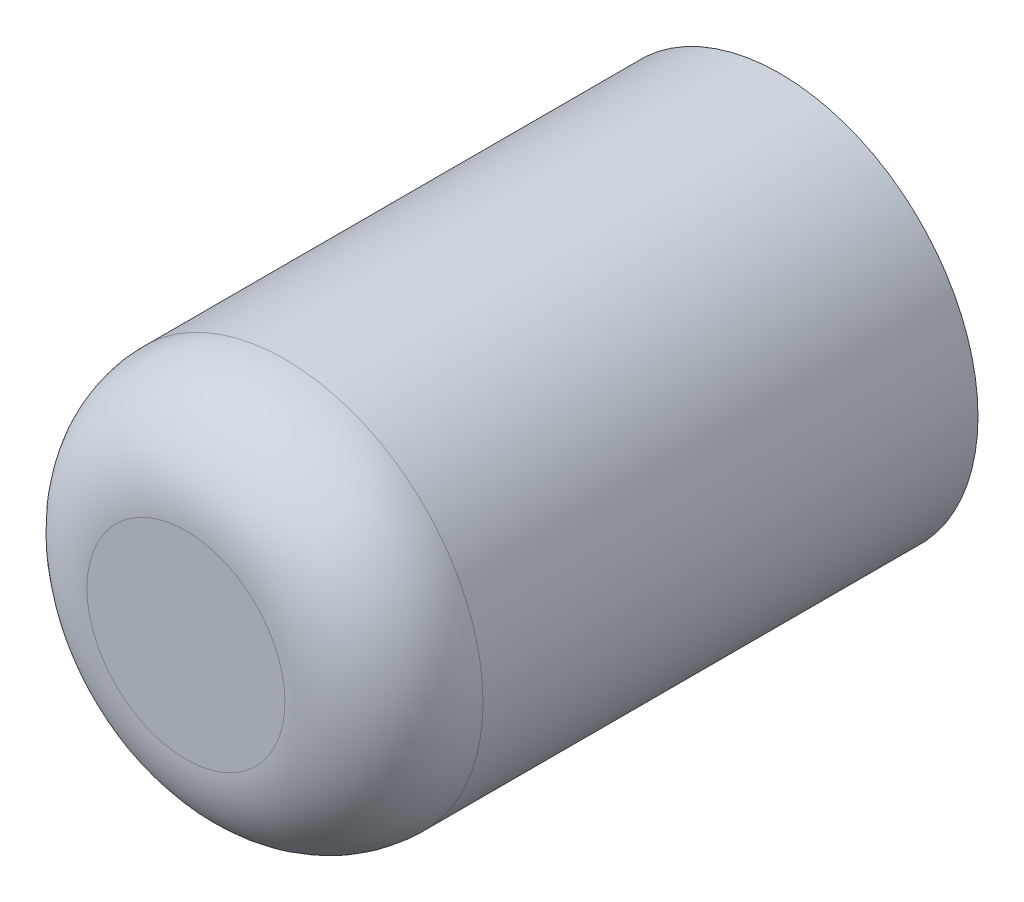
ISO-10303-21;
HEADER;
FILE_DESCRIPTION(('STEP AP214'),'2;1');
FILE_NAME('part.step','',(''),(''),'','','');
FILE_SCHEMA(('AUTOMOTIVE_DESIGN { 1 0 10303 214 1 1 1 1 }'));
ENDSEC;
DATA;
#1=APPLICATION_CONTEXT('core data for automotive mechanical design processes');
#2=APPLICATION_PROTOCOL_DEFINITION('international standard','automotive_design',2000,#1);
#3=PRODUCT_CONTEXT('',#1,'mechanical');
#4=PRODUCT('Part','Part','',(#3));
#5=PRODUCT_RELATED_PRODUCT_CATEGORY('part','',(#4));
#6=PRODUCT_DEFINITION_FORMATION('','',#4);
#7=PRODUCT_DEFINITION_CONTEXT('part definition',#1,'design');
#8=PRODUCT_DEFINITION('design','',#6,#7);
#9=PRODUCT_DEFINITION_SHAPE('','',#8);
#10=(LENGTH_UNIT() NAMED_UNIT(*) SI_UNIT(.MILLI.,.METRE.));
#11=(NAMED_UNIT(*) PLANE_ANGLE_UNIT() SI_UNIT($,.RADIAN.));
#12=(NAMED_UNIT(*) SI_UNIT($,.STERADIAN.) SOLID_ANGLE_UNIT());
#13=UNCERTAINTY_MEASURE_WITH_UNIT(LENGTH_MEASURE(1.E-05),#10,'distance_accuracy_value','');
#14=(GEOMETRIC_REPRESENTATION_CONTEXT(3) GLOBAL_UNCERTAINTY_ASSIGNED_CONTEXT((#13)) GLOBAL_UNIT_ASSIGNED_CONTEXT((#10,
#11,#12)) REPRESENTATION_CONTEXT('',''));
#15=CARTESIAN_POINT('',(0.,0.,0.));
#16=DIRECTION('',(0.,0.,1.));
#17=DIRECTION('',(1.,0.,0.));
#18=AXIS2_PLACEMENT_3D('',#15,#16,#17);
#19=CARTESIAN_POINT('',(0.,0.,6.));
#20=DIRECTION('',(0.,0.,-1.));
#21=DIRECTION('',(-1.,0.,0.));
#22=AXIS2_PLACEMENT_3D('',#19,#20,#21);
#23=CYLINDRICAL_SURFACE('',#22,2.);
#24=CARTESIAN_POINT('',(0.,0.,5.));
#25=DIRECTION('',(0.,0.,1.));
#26=DIRECTION('',(1.,0.,0.));
#27=AXIS2_PLACEMENT_3D('',#24,#25,#26);
#28=CIRCLE('',#27,2.);
#29=CARTESIAN_POINT('',(2.,0.,5.));
#30=VERTEX_POINT('',#29);
#31=EDGE_CURVE('E11',#30,#30,#28,.F.);
#32=ORIENTED_EDGE('',*,*,#31,.T.);
#33=EDGE_LOOP('',(#32));
#34=FACE_BOUND('',#33,.T.);
#35=CARTESIAN_POINT('',(0.,0.,0.));
#36=DIRECTION('',(0.,0.,1.));
#37=DIRECTION('',(1.,0.,0.));
#38=AXIS2_PLACEMENT_3D('',#35,#36,#37);
#39=CIRCLE('',#38,2.);
#40=CARTESIAN_POINT('',(2.,0.,0.));
#41=VERTEX_POINT('',#40);
#42=EDGE_CURVE('E154',#41,#41,#39,.T.);
#43=ORIENTED_EDGE('',*,*,#42,.T.);
#44=EDGE_LOOP('',(#43));
#45=FACE_BOUND('',#44,.T.);
#46=ADVANCED_FACE('F39',(#34,#45),#23,.T.);
#47=CARTESIAN_POINT('',(0.,0.,6.));
#48=DIRECTION('',(0.,0.,1.));
#49=DIRECTION('',(1.,0.,0.));
#50=AXIS2_PLACEMENT_3D('',#47,#48,#49);
#51=PLANE('',#50);
#52=CARTESIAN_POINT('',(0.,0.,6.));
#53=DIRECTION('',(0.,0.,1.));
#54=DIRECTION('',(1.,0.,0.));
#55=AXIS2_PLACEMENT_3D('',#52,#53,#54);
#56=CIRCLE('',#55,1.);
#57=CARTESIAN_POINT('',(1.,0.,6.));
#58=VERTEX_POINT('',#57);
#59=EDGE_CURVE('E48',#58,#58,#56,.T.);
#60=ORIENTED_EDGE('',*,*,#59,.T.);
#61=EDGE_LOOP('',(#60));
#62=FACE_BOUND('',#61,.T.);
#63=ADVANCED_FACE('F170',(#62),#51,.T.);
#64=CARTESIAN_POINT('',(0.,0.,0.));
#65=DIRECTION('',(0.,0.,1.));
#66=DIRECTION('',(1.,0.,0.));
#67=AXIS2_PLACEMENT_3D('',#64,#65,#66);
#68=PLANE('',#67);
#69=DIRECTION('',(0.5,0.866025403784439,0.));
#70=VECTOR('',#69,1.);
#71=CARTESIAN_POINT('',(-1.15470053837925,0.,0.));
#72=LINE('',#71,#70);
#73=CARTESIAN_POINT('',(-1.15470053837925,0.,0.));
#74=VERTEX_POINT('',#73);
#75=CARTESIAN_POINT('',(-0.577350269189625,1.,0.));
#76=VERTEX_POINT('',#75);
#77=EDGE_CURVE('E135',#74,#76,#72,.T.);
#78=ORIENTED_EDGE('',*,*,#77,.F.);
#79=DIRECTION('',(-0.499999999999999,0.866025403784439,0.));
#80=VECTOR('',#79,1.);
#81=CARTESIAN_POINT('',(-0.577350269189626,-1.,0.));
#82=LINE('',#81,#80);
#83=CARTESIAN_POINT('',(-0.577350269189626,-1.,0.));
#84=VERTEX_POINT('',#83);
#85=EDGE_CURVE('E55',#84,#74,#82,.T.);
#86=ORIENTED_EDGE('',*,*,#85,.F.);
#87=DIRECTION('',(-1.,0.,0.));
#88=VECTOR('',#87,1.);
#89=CARTESIAN_POINT('',(0.577350269189626,-1.,0.));
#90=LINE('',#89,#88);
#91=CARTESIAN_POINT('',(0.577350269189626,-1.,0.));
#92=VERTEX_POINT('',#91);
#93=EDGE_CURVE('E148',#92,#84,#90,.T.);
#94=ORIENTED_EDGE('',*,*,#93,.F.);
#95=DIRECTION('',(-0.5,-0.866025403784438,0.));
#96=VECTOR('',#95,1.);
#97=CARTESIAN_POINT('',(1.15470053837925,0.,0.));
#98=LINE('',#97,#96);
#99=CARTESIAN_POINT('',(1.15470053837925,0.,0.));
#100=VERTEX_POINT('',#99);
#101=EDGE_CURVE('E145',#100,#92,#98,.T.);
#102=ORIENTED_EDGE('',*,*,#101,.F.);
#103=DIRECTION('',(0.5,-0.866025403784439,0.));
#104=VECTOR('',#103,1.);
#105=CARTESIAN_POINT('',(0.577350269189626,1.,0.));
#106=LINE('',#105,#104);
#107=CARTESIAN_POINT('',(0.577350269189626,1.,0.));
#108=VERTEX_POINT('',#107);
#109=EDGE_CURVE('E103',#108,#100,#106,.T.);
#110=ORIENTED_EDGE('',*,*,#109,.F.);
#111=DIRECTION('',(1.,0.,0.));
#112=VECTOR('',#111,1.);
#113=CARTESIAN_POINT('',(-0.577350269189625,1.,0.));
#114=LINE('',#113,#112);
#115=EDGE_CURVE('E139',#76,#108,#114,.T.);
#116=ORIENTED_EDGE('',*,*,#115,.F.);
#117=EDGE_LOOP('',(#78,#86,#94,#102,#110,#116));
#118=FACE_BOUND('',#117,.T.);
#119=ORIENTED_EDGE('',*,*,#42,.F.);
#120=EDGE_LOOP('',(#119));
#121=FACE_BOUND('',#120,.T.);
#122=ADVANCED_FACE('F174',(#118,#121),#68,.F.);
#123=CARTESIAN_POINT('',(0.,0.,5.));
#124=DIRECTION('',(0.,0.,1.));
#125=DIRECTION('',(1.,0.,0.));
#126=AXIS2_PLACEMENT_3D('',#123,#124,#125);
#127=DEGENERATE_TOROIDAL_SURFACE('',#126,1.,1.,.T.);
#128=ORIENTED_EDGE('',*,*,#31,.F.);
#129=EDGE_LOOP('',(#128));
#130=FACE_BOUND('',#129,.T.);
#131=ORIENTED_EDGE('',*,*,#59,.F.);
#132=EDGE_LOOP('',(#131));
#133=FACE_BOUND('',#132,.T.);
#134=ADVANCED_FACE('F41',(#130,#133),#127,.T.);
#135=CARTESIAN_POINT('',(-0.577350269189626,-1.,1.5));
#136=DIRECTION('',(-0.866025403784439,-0.5,0.));
#137=DIRECTION('',(0.5,-0.866025403784439,0.));
#138=AXIS2_PLACEMENT_3D('',#135,#136,#137);
#139=PLANE('',#138);
#140=ORIENTED_EDGE('',*,*,#85,.T.);
#141=DIRECTION('',(0.,0.,-1.));
#142=VECTOR('',#141,1.);
#143=CARTESIAN_POINT('',(-1.15470053837925,0.,1.5));
#144=LINE('',#143,#142);
#145=CARTESIAN_POINT('',(-1.15470053837925,0.,1.5));
#146=VERTEX_POINT('',#145);
#147=EDGE_CURVE('E85',#146,#74,#144,.T.);
#148=ORIENTED_EDGE('',*,*,#147,.F.);
#149=DIRECTION('',(-0.499999999999999,0.866025403784439,0.));
#150=VECTOR('',#149,1.);
#151=CARTESIAN_POINT('',(-0.577350269189626,-1.,1.5));
#152=LINE('',#151,#150);
#153=CARTESIAN_POINT('',(-0.577350269189626,-1.,1.5));
#154=VERTEX_POINT('',#153);
#155=EDGE_CURVE('E151',#154,#146,#152,.T.);
#156=ORIENTED_EDGE('',*,*,#155,.F.);
#157=DIRECTION('',(0.,0.,-1.));
#158=VECTOR('',#157,1.);
#159=CARTESIAN_POINT('',(-0.577350269189626,-1.,1.5));
#160=LINE('',#159,#158);
#161=EDGE_CURVE('E63',#154,#84,#160,.T.);
#162=ORIENTED_EDGE('',*,*,#161,.T.);
#163=EDGE_LOOP('',(#140,#148,#156,#162));
#164=FACE_BOUND('',#163,.T.);
#165=ADVANCED_FACE('F173',(#164),#139,.F.);
#166=CARTESIAN_POINT('',(0.577350269189626,-1.,1.5));
#167=DIRECTION('',(0.,-1.,0.));
#168=DIRECTION('',(0.,0.,-1.));
#169=AXIS2_PLACEMENT_3D('',#166,#167,#168);
#170=PLANE('',#169);
#171=ORIENTED_EDGE('',*,*,#93,.T.);
#172=ORIENTED_EDGE('',*,*,#161,.F.);
#173=DIRECTION('',(-1.,0.,0.));
#174=VECTOR('',#173,1.);
#175=CARTESIAN_POINT('',(0.577350269189626,-1.,1.5));
#176=LINE('',#175,#174);
#177=CARTESIAN_POINT('',(0.577350269189626,-1.,1.5));
#178=VERTEX_POINT('',#177);
#179=EDGE_CURVE('E117',#178,#154,#176,.T.);
#180=ORIENTED_EDGE('',*,*,#179,.F.);
#181=DIRECTION('',(0.,0.,-1.));
#182=VECTOR('',#181,1.);
#183=CARTESIAN_POINT('',(0.577350269189626,-1.,1.5));
#184=LINE('',#183,#182);
#185=EDGE_CURVE('E108',#178,#92,#184,.T.);
#186=ORIENTED_EDGE('',*,*,#185,.T.);
#187=EDGE_LOOP('',(#171,#172,#180,#186));
#188=FACE_BOUND('',#187,.T.);
#189=ADVANCED_FACE('F180',(#188),#170,.F.);
#190=CARTESIAN_POINT('',(1.15470053837925,0.,1.5));
#191=DIRECTION('',(0.866025403784439,-0.5,0.));
#192=DIRECTION('',(0.5,0.866025403784439,0.));
#193=AXIS2_PLACEMENT_3D('',#190,#191,#192);
#194=PLANE('',#193);
#195=ORIENTED_EDGE('',*,*,#101,.T.);
#196=ORIENTED_EDGE('',*,*,#185,.F.);
#197=DIRECTION('',(-0.5,-0.866025403784438,0.));
#198=VECTOR('',#197,1.);
#199=CARTESIAN_POINT('',(1.15470053837925,0.,1.5));
#200=LINE('',#199,#198);
#201=CARTESIAN_POINT('',(1.15470053837925,0.,1.5));
#202=VERTEX_POINT('',#201);
#203=EDGE_CURVE('E112',#202,#178,#200,.T.);
#204=ORIENTED_EDGE('',*,*,#203,.F.);
#205=DIRECTION('',(0.,0.,-1.));
#206=VECTOR('',#205,1.);
#207=CARTESIAN_POINT('',(1.15470053837925,0.,1.5));
#208=LINE('',#207,#206);
#209=EDGE_CURVE('E96',#202,#100,#208,.T.);
#210=ORIENTED_EDGE('',*,*,#209,.T.);
#211=EDGE_LOOP('',(#195,#196,#204,#210));
#212=FACE_BOUND('',#211,.T.);
#213=ADVANCED_FACE('F113',(#212),#194,.F.);
#214=CARTESIAN_POINT('',(0.577350269189626,1.,1.5));
#215=DIRECTION('',(0.866025403784439,0.5,0.));
#216=DIRECTION('',(-0.5,0.866025403784439,0.));
#217=AXIS2_PLACEMENT_3D('',#214,#215,#216);
#218=PLANE('',#217);
#219=ORIENTED_EDGE('',*,*,#109,.T.);
#220=ORIENTED_EDGE('',*,*,#209,.F.);
#221=DIRECTION('',(0.5,-0.866025403784439,0.));
#222=VECTOR('',#221,1.);
#223=CARTESIAN_POINT('',(0.577350269189626,1.,1.5));
#224=LINE('',#223,#222);
#225=CARTESIAN_POINT('',(0.577350269189626,1.,1.5));
#226=VERTEX_POINT('',#225);
#227=EDGE_CURVE('E100',#226,#202,#224,.T.);
#228=ORIENTED_EDGE('',*,*,#227,.F.);
#229=DIRECTION('',(0.,0.,-1.));
#230=VECTOR('',#229,1.);
#231=CARTESIAN_POINT('',(0.577350269189626,1.,1.5));
#232=LINE('',#231,#230);
#233=EDGE_CURVE('E109',#226,#108,#232,.T.);
#234=ORIENTED_EDGE('',*,*,#233,.T.);
#235=EDGE_LOOP('',(#219,#220,#228,#234));
#236=FACE_BOUND('',#235,.T.);
#237=ADVANCED_FACE('F98',(#236),#218,.F.);
#238=CARTESIAN_POINT('',(-0.577350269189625,1.,1.5));
#239=DIRECTION('',(0.,1.,0.));
#240=DIRECTION('',(-1.,0.,0.));
#241=AXIS2_PLACEMENT_3D('',#238,#239,#240);
#242=PLANE('',#241);
#243=ORIENTED_EDGE('',*,*,#115,.T.);
#244=ORIENTED_EDGE('',*,*,#233,.F.);
#245=DIRECTION('',(1.,0.,0.));
#246=VECTOR('',#245,1.);
#247=CARTESIAN_POINT('',(-0.577350269189625,1.,1.5));
#248=LINE('',#247,#246);
#249=CARTESIAN_POINT('',(-0.577350269189625,1.,1.5));
#250=VERTEX_POINT('',#249);
#251=EDGE_CURVE('E123',#250,#226,#248,.T.);
#252=ORIENTED_EDGE('',*,*,#251,.F.);
#253=DIRECTION('',(0.,0.,-1.));
#254=VECTOR('',#253,1.);
#255=CARTESIAN_POINT('',(-0.577350269189625,1.,1.5));
#256=LINE('',#255,#254);
#257=EDGE_CURVE('E159',#250,#76,#256,.T.);
#258=ORIENTED_EDGE('',*,*,#257,.T.);
#259=EDGE_LOOP('',(#243,#244,#252,#258));
#260=FACE_BOUND('',#259,.T.);
#261=ADVANCED_FACE('F196',(#260),#242,.F.);
#262=CARTESIAN_POINT('',(-1.15470053837925,0.,1.5));
#263=DIRECTION('',(-0.866025403784439,0.5,0.));
#264=DIRECTION('',(-0.5,-0.866025403784439,0.));
#265=AXIS2_PLACEMENT_3D('',#262,#263,#264);
#266=PLANE('',#265);
#267=ORIENTED_EDGE('',*,*,#77,.T.);
#268=ORIENTED_EDGE('',*,*,#257,.F.);
#269=DIRECTION('',(0.5,0.866025403784439,0.));
#270=VECTOR('',#269,1.);
#271=CARTESIAN_POINT('',(-1.15470053837925,0.,1.5));
#272=LINE('',#271,#270);
#273=EDGE_CURVE('E127',#146,#250,#272,.T.);
#274=ORIENTED_EDGE('',*,*,#273,.F.);
#275=ORIENTED_EDGE('',*,*,#147,.T.);
#276=EDGE_LOOP('',(#267,#268,#274,#275));
#277=FACE_BOUND('',#276,.T.);
#278=ADVANCED_FACE('F193',(#277),#266,.F.);
#279=CARTESIAN_POINT('',(0.,0.,1.5));
#280=DIRECTION('',(0.,0.,-1.));
#281=DIRECTION('',(-1.,0.,0.));
#282=AXIS2_PLACEMENT_3D('',#279,#280,#281);
#283=PLANE('',#282);
#284=ORIENTED_EDGE('',*,*,#155,.T.);
#285=ORIENTED_EDGE('',*,*,#273,.T.);
#286=ORIENTED_EDGE('',*,*,#251,.T.);
#287=ORIENTED_EDGE('',*,*,#227,.T.);
#288=ORIENTED_EDGE('',*,*,#203,.T.);
#289=ORIENTED_EDGE('',*,*,#179,.T.);
#290=EDGE_LOOP('',(#284,#285,#286,#287,#288,#289));
#291=FACE_BOUND('',#290,.T.);
#292=ADVANCED_FACE('F120',(#291),#283,.T.);
#293=CLOSED_SHELL('',(#46,#63,#122,#134,#165,#189,#213,#237,#261,#278,#292));
#294=MANIFOLD_SOLID_BREP('B2',#293);
#295=ADVANCED_BREP_SHAPE_REPRESENTATION('',(#18,#294),#14);
#296=SHAPE_DEFINITION_REPRESENTATION(#9,#295);
ENDSEC;
END-ISO-10303-21;
